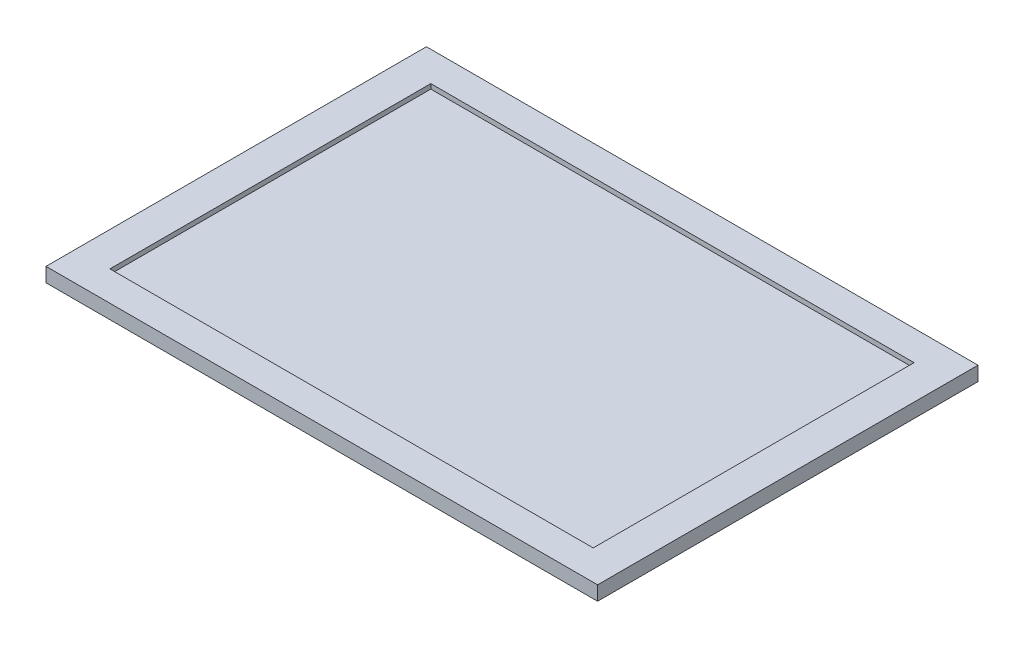
ISO-10303-21;
HEADER;
FILE_DESCRIPTION(('STEP AP214'),'2;1');
FILE_NAME('part.step','',(''),(''),'','','');
FILE_SCHEMA(('AUTOMOTIVE_DESIGN { 1 0 10303 214 1 1 1 1 }'));
ENDSEC;
DATA;
#1=APPLICATION_CONTEXT('core data for automotive mechanical design processes');
#2=APPLICATION_PROTOCOL_DEFINITION('international standard','automotive_design',2000,#1);
#3=PRODUCT_CONTEXT('',#1,'mechanical');
#4=PRODUCT('Part','Part','',(#3));
#5=PRODUCT_RELATED_PRODUCT_CATEGORY('part','',(#4));
#6=PRODUCT_DEFINITION_FORMATION('','',#4);
#7=PRODUCT_DEFINITION_CONTEXT('part definition',#1,'design');
#8=PRODUCT_DEFINITION('design','',#6,#7);
#9=PRODUCT_DEFINITION_SHAPE('','',#8);
#10=(LENGTH_UNIT() NAMED_UNIT(*) SI_UNIT(.MILLI.,.METRE.));
#11=(NAMED_UNIT(*) PLANE_ANGLE_UNIT() SI_UNIT($,.RADIAN.));
#12=(NAMED_UNIT(*) SI_UNIT($,.STERADIAN.) SOLID_ANGLE_UNIT());
#13=UNCERTAINTY_MEASURE_WITH_UNIT(LENGTH_MEASURE(1.E-05),#10,'distance_accuracy_value','');
#14=(GEOMETRIC_REPRESENTATION_CONTEXT(3) GLOBAL_UNCERTAINTY_ASSIGNED_CONTEXT((#13)) GLOBAL_UNIT_ASSIGNED_CONTEXT((#10,
#11,#12)) REPRESENTATION_CONTEXT('',''));
#15=CARTESIAN_POINT('',(0.,0.,0.));
#16=DIRECTION('',(0.,0.,1.));
#17=DIRECTION('',(1.,0.,0.));
#18=AXIS2_PLACEMENT_3D('',#15,#16,#17);
#19=CARTESIAN_POINT('',(147.32,7.62,101.6));
#20=DIRECTION('',(-1.,0.,0.));
#21=DIRECTION('',(0.,0.,1.));
#22=AXIS2_PLACEMENT_3D('',#19,#20,#21);
#23=PLANE('',#22);
#24=DIRECTION('',(0.,0.,-1.));
#25=VECTOR('',#24,1.);
#26=CARTESIAN_POINT('',(147.32,0.,101.6));
#27=LINE('',#26,#25);
#28=CARTESIAN_POINT('',(147.32,0.,101.6));
#29=VERTEX_POINT('',#28);
#30=CARTESIAN_POINT('',(147.32,0.,-101.6));
#31=VERTEX_POINT('',#30);
#32=EDGE_CURVE('E141',#29,#31,#27,.T.);
#33=ORIENTED_EDGE('',*,*,#32,.T.);
#34=DIRECTION('',(0.,-1.,0.));
#35=VECTOR('',#34,1.);
#36=CARTESIAN_POINT('',(147.32,7.62,-101.6));
#37=LINE('',#36,#35);
#38=CARTESIAN_POINT('',(147.32,7.62,-101.6));
#39=VERTEX_POINT('',#38);
#40=EDGE_CURVE('E11',#39,#31,#37,.T.);
#41=ORIENTED_EDGE('',*,*,#40,.F.);
#42=DIRECTION('',(0.,0.,-1.));
#43=VECTOR('',#42,1.);
#44=CARTESIAN_POINT('',(147.32,7.62,101.6));
#45=LINE('',#44,#43);
#46=CARTESIAN_POINT('',(147.32,7.62,101.6));
#47=VERTEX_POINT('',#46);
#48=EDGE_CURVE('E145',#47,#39,#45,.T.);
#49=ORIENTED_EDGE('',*,*,#48,.F.);
#50=DIRECTION('',(0.,-1.,0.));
#51=VECTOR('',#50,1.);
#52=CARTESIAN_POINT('',(147.32,7.62,101.6));
#53=LINE('',#52,#51);
#54=EDGE_CURVE('E151',#47,#29,#53,.T.);
#55=ORIENTED_EDGE('',*,*,#54,.T.);
#56=EDGE_LOOP('',(#33,#41,#49,#55));
#57=FACE_BOUND('',#56,.T.);
#58=ADVANCED_FACE('F33',(#57),#23,.F.);
#59=CARTESIAN_POINT('',(-147.32,7.62,-101.6));
#60=DIRECTION('',(0.,0.,1.));
#61=DIRECTION('',(1.,0.,0.));
#62=AXIS2_PLACEMENT_3D('',#59,#60,#61);
#63=PLANE('',#62);
#64=DIRECTION('',(-1.,0.,0.));
#65=VECTOR('',#64,1.);
#66=CARTESIAN_POINT('',(-147.32,0.,-101.6));
#67=LINE('',#66,#65);
#68=CARTESIAN_POINT('',(-147.32,0.,-101.6));
#69=VERTEX_POINT('',#68);
#70=EDGE_CURVE('E154',#31,#69,#67,.T.);
#71=ORIENTED_EDGE('',*,*,#70,.T.);
#72=DIRECTION('',(0.,-1.,0.));
#73=VECTOR('',#72,1.);
#74=CARTESIAN_POINT('',(-147.32,7.62,-101.6));
#75=LINE('',#74,#73);
#76=CARTESIAN_POINT('',(-147.32,7.62,-101.6));
#77=VERTEX_POINT('',#76);
#78=EDGE_CURVE('E40',#77,#69,#75,.T.);
#79=ORIENTED_EDGE('',*,*,#78,.F.);
#80=DIRECTION('',(-1.,0.,0.));
#81=VECTOR('',#80,1.);
#82=CARTESIAN_POINT('',(-147.32,7.62,-101.6));
#83=LINE('',#82,#81);
#84=EDGE_CURVE('E84',#39,#77,#83,.T.);
#85=ORIENTED_EDGE('',*,*,#84,.F.);
#86=ORIENTED_EDGE('',*,*,#40,.T.);
#87=EDGE_LOOP('',(#71,#79,#85,#86));
#88=FACE_BOUND('',#87,.T.);
#89=ADVANCED_FACE('F183',(#88),#63,.F.);
#90=CARTESIAN_POINT('',(-147.32,7.62,101.6));
#91=DIRECTION('',(1.,0.,0.));
#92=DIRECTION('',(0.,0.,-1.));
#93=AXIS2_PLACEMENT_3D('',#90,#91,#92);
#94=PLANE('',#93);
#95=DIRECTION('',(0.,0.,1.));
#96=VECTOR('',#95,1.);
#97=CARTESIAN_POINT('',(-147.32,0.,101.6));
#98=LINE('',#97,#96);
#99=CARTESIAN_POINT('',(-147.32,0.,101.6));
#100=VERTEX_POINT('',#99);
#101=EDGE_CURVE('E156',#69,#100,#98,.T.);
#102=ORIENTED_EDGE('',*,*,#101,.T.);
#103=DIRECTION('',(0.,-1.,0.));
#104=VECTOR('',#103,1.);
#105=CARTESIAN_POINT('',(-147.32,7.62,101.6));
#106=LINE('',#105,#104);
#107=CARTESIAN_POINT('',(-147.32,7.62,101.6));
#108=VERTEX_POINT('',#107);
#109=EDGE_CURVE('E160',#108,#100,#106,.T.);
#110=ORIENTED_EDGE('',*,*,#109,.F.);
#111=DIRECTION('',(0.,0.,1.));
#112=VECTOR('',#111,1.);
#113=CARTESIAN_POINT('',(-147.32,7.62,101.6));
#114=LINE('',#113,#112);
#115=EDGE_CURVE('E148',#77,#108,#114,.T.);
#116=ORIENTED_EDGE('',*,*,#115,.F.);
#117=ORIENTED_EDGE('',*,*,#78,.T.);
#118=EDGE_LOOP('',(#102,#110,#116,#117));
#119=FACE_BOUND('',#118,.T.);
#120=ADVANCED_FACE('F165',(#119),#94,.F.);
#121=CARTESIAN_POINT('',(-147.32,7.62,101.6));
#122=DIRECTION('',(0.,0.,-1.));
#123=DIRECTION('',(-1.,0.,0.));
#124=AXIS2_PLACEMENT_3D('',#121,#122,#123);
#125=PLANE('',#124);
#126=DIRECTION('',(1.,0.,0.));
#127=VECTOR('',#126,1.);
#128=CARTESIAN_POINT('',(-147.32,0.,101.6));
#129=LINE('',#128,#127);
#130=EDGE_CURVE('E77',#100,#29,#129,.T.);
#131=ORIENTED_EDGE('',*,*,#130,.T.);
#132=ORIENTED_EDGE('',*,*,#54,.F.);
#133=DIRECTION('',(1.,0.,0.));
#134=VECTOR('',#133,1.);
#135=CARTESIAN_POINT('',(-147.32,7.62,101.6));
#136=LINE('',#135,#134);
#137=EDGE_CURVE('E56',#108,#47,#136,.T.);
#138=ORIENTED_EDGE('',*,*,#137,.F.);
#139=ORIENTED_EDGE('',*,*,#109,.T.);
#140=EDGE_LOOP('',(#131,#132,#138,#139));
#141=FACE_BOUND('',#140,.T.);
#142=ADVANCED_FACE('F173',(#141),#125,.F.);
#143=CARTESIAN_POINT('',(0.,7.62,0.));
#144=DIRECTION('',(0.,-1.,0.));
#145=DIRECTION('',(0.,0.,-1.));
#146=AXIS2_PLACEMENT_3D('',#143,#144,#145);
#147=PLANE('',#146);
#148=DIRECTION('',(-1.,0.,0.));
#149=VECTOR('',#148,1.);
#150=CARTESIAN_POINT('',(-129.077610945295,7.62,-85.7051570948623));
#151=LINE('',#150,#149);
#152=CARTESIAN_POINT('',(129.077610945295,7.62,-85.7051570948623));
#153=VERTEX_POINT('',#152);
#154=CARTESIAN_POINT('',(-129.077610945295,7.62,-85.7051570948623));
#155=VERTEX_POINT('',#154);
#156=EDGE_CURVE('E135',#153,#155,#151,.T.);
#157=ORIENTED_EDGE('',*,*,#156,.F.);
#158=DIRECTION('',(0.,0.,-1.));
#159=VECTOR('',#158,1.);
#160=CARTESIAN_POINT('',(129.077610945295,7.62,85.7051570948623));
#161=LINE('',#160,#159);
#162=CARTESIAN_POINT('',(129.077610945295,7.62,85.7051570948623));
#163=VERTEX_POINT('',#162);
#164=EDGE_CURVE('E47',#163,#153,#161,.T.);
#165=ORIENTED_EDGE('',*,*,#164,.F.);
#166=DIRECTION('',(1.,0.,0.));
#167=VECTOR('',#166,1.);
#168=CARTESIAN_POINT('',(-129.077610945295,7.62,85.7051570948623));
#169=LINE('',#168,#167);
#170=CARTESIAN_POINT('',(-129.077610945295,7.62,85.7051570948623));
#171=VERTEX_POINT('',#170);
#172=EDGE_CURVE('E126',#171,#163,#169,.T.);
#173=ORIENTED_EDGE('',*,*,#172,.F.);
#174=DIRECTION('',(0.,0.,1.));
#175=VECTOR('',#174,1.);
#176=CARTESIAN_POINT('',(-129.077610945295,7.62,85.7051570948623));
#177=LINE('',#176,#175);
#178=EDGE_CURVE('E129',#155,#171,#177,.T.);
#179=ORIENTED_EDGE('',*,*,#178,.F.);
#180=EDGE_LOOP('',(#157,#165,#173,#179));
#181=FACE_BOUND('',#180,.T.);
#182=ORIENTED_EDGE('',*,*,#48,.T.);
#183=ORIENTED_EDGE('',*,*,#84,.T.);
#184=ORIENTED_EDGE('',*,*,#115,.T.);
#185=ORIENTED_EDGE('',*,*,#137,.T.);
#186=EDGE_LOOP('',(#182,#183,#184,#185));
#187=FACE_BOUND('',#186,.T.);
#188=ADVANCED_FACE('F175',(#181,#187),#147,.F.);
#189=CARTESIAN_POINT('',(0.,0.,0.));
#190=DIRECTION('',(0.,-1.,0.));
#191=DIRECTION('',(0.,0.,-1.));
#192=AXIS2_PLACEMENT_3D('',#189,#190,#191);
#193=PLANE('',#192);
#194=ORIENTED_EDGE('',*,*,#32,.F.);
#195=ORIENTED_EDGE('',*,*,#130,.F.);
#196=ORIENTED_EDGE('',*,*,#101,.F.);
#197=ORIENTED_EDGE('',*,*,#70,.F.);
#198=EDGE_LOOP('',(#194,#195,#196,#197));
#199=FACE_BOUND('',#198,.T.);
#200=ADVANCED_FACE('F169',(#199),#193,.T.);
#201=CARTESIAN_POINT('',(129.077610945295,5.08,85.7051570948623));
#202=DIRECTION('',(1.,0.,0.));
#203=DIRECTION('',(0.,0.,-1.));
#204=AXIS2_PLACEMENT_3D('',#201,#202,#203);
#205=PLANE('',#204);
#206=ORIENTED_EDGE('',*,*,#164,.T.);
#207=DIRECTION('',(0.,1.,0.));
#208=VECTOR('',#207,1.);
#209=CARTESIAN_POINT('',(129.077610945295,5.08,-85.7051570948623));
#210=LINE('',#209,#208);
#211=CARTESIAN_POINT('',(129.077610945295,5.08,-85.7051570948623));
#212=VERTEX_POINT('',#211);
#213=EDGE_CURVE('E104',#212,#153,#210,.T.);
#214=ORIENTED_EDGE('',*,*,#213,.F.);
#215=DIRECTION('',(0.,0.,-1.));
#216=VECTOR('',#215,1.);
#217=CARTESIAN_POINT('',(129.077610945295,5.08,85.7051570948623));
#218=LINE('',#217,#216);
#219=CARTESIAN_POINT('',(129.077610945295,5.08,85.7051570948623));
#220=VERTEX_POINT('',#219);
#221=EDGE_CURVE('E108',#220,#212,#218,.T.);
#222=ORIENTED_EDGE('',*,*,#221,.F.);
#223=DIRECTION('',(0.,1.,0.));
#224=VECTOR('',#223,1.);
#225=CARTESIAN_POINT('',(129.077610945295,5.08,85.7051570948623));
#226=LINE('',#225,#224);
#227=EDGE_CURVE('E139',#220,#163,#226,.T.);
#228=ORIENTED_EDGE('',*,*,#227,.T.);
#229=EDGE_LOOP('',(#206,#214,#222,#228));
#230=FACE_BOUND('',#229,.T.);
#231=ADVANCED_FACE('F106',(#230),#205,.F.);
#232=CARTESIAN_POINT('',(-129.077610945295,5.08,85.7051570948623));
#233=DIRECTION('',(0.,0.,1.));
#234=DIRECTION('',(1.,0.,0.));
#235=AXIS2_PLACEMENT_3D('',#232,#233,#234);
#236=PLANE('',#235);
#237=ORIENTED_EDGE('',*,*,#172,.T.);
#238=ORIENTED_EDGE('',*,*,#227,.F.);
#239=DIRECTION('',(1.,0.,0.));
#240=VECTOR('',#239,1.);
#241=CARTESIAN_POINT('',(-129.077610945295,5.08,85.7051570948623));
#242=LINE('',#241,#240);
#243=CARTESIAN_POINT('',(-129.077610945295,5.08,85.7051570948623));
#244=VERTEX_POINT('',#243);
#245=EDGE_CURVE('E114',#244,#220,#242,.T.);
#246=ORIENTED_EDGE('',*,*,#245,.F.);
#247=DIRECTION('',(0.,1.,0.));
#248=VECTOR('',#247,1.);
#249=CARTESIAN_POINT('',(-129.077610945295,5.08,85.7051570948623));
#250=LINE('',#249,#248);
#251=EDGE_CURVE('E142',#244,#171,#250,.T.);
#252=ORIENTED_EDGE('',*,*,#251,.T.);
#253=EDGE_LOOP('',(#237,#238,#246,#252));
#254=FACE_BOUND('',#253,.T.);
#255=ADVANCED_FACE('F222',(#254),#236,.F.);
#256=CARTESIAN_POINT('',(-129.077610945295,5.08,85.7051570948623));
#257=DIRECTION('',(-1.,0.,0.));
#258=DIRECTION('',(0.,0.,1.));
#259=AXIS2_PLACEMENT_3D('',#256,#257,#258);
#260=PLANE('',#259);
#261=ORIENTED_EDGE('',*,*,#178,.T.);
#262=ORIENTED_EDGE('',*,*,#251,.F.);
#263=DIRECTION('',(0.,0.,1.));
#264=VECTOR('',#263,1.);
#265=CARTESIAN_POINT('',(-129.077610945295,5.08,85.7051570948623));
#266=LINE('',#265,#264);
#267=CARTESIAN_POINT('',(-129.077610945295,5.08,-85.7051570948623));
#268=VERTEX_POINT('',#267);
#269=EDGE_CURVE('E122',#268,#244,#266,.T.);
#270=ORIENTED_EDGE('',*,*,#269,.F.);
#271=DIRECTION('',(0.,1.,0.));
#272=VECTOR('',#271,1.);
#273=CARTESIAN_POINT('',(-129.077610945295,5.08,-85.7051570948623));
#274=LINE('',#273,#272);
#275=EDGE_CURVE('E113',#268,#155,#274,.T.);
#276=ORIENTED_EDGE('',*,*,#275,.T.);
#277=EDGE_LOOP('',(#261,#262,#270,#276));
#278=FACE_BOUND('',#277,.T.);
#279=ADVANCED_FACE('F231',(#278),#260,.F.);
#280=CARTESIAN_POINT('',(-129.077610945295,5.08,-85.7051570948623));
#281=DIRECTION('',(0.,0.,-1.));
#282=DIRECTION('',(-1.,0.,0.));
#283=AXIS2_PLACEMENT_3D('',#280,#281,#282);
#284=PLANE('',#283);
#285=ORIENTED_EDGE('',*,*,#156,.T.);
#286=ORIENTED_EDGE('',*,*,#275,.F.);
#287=DIRECTION('',(-1.,0.,0.));
#288=VECTOR('',#287,1.);
#289=CARTESIAN_POINT('',(-129.077610945295,5.08,-85.7051570948623));
#290=LINE('',#289,#288);
#291=EDGE_CURVE('E117',#212,#268,#290,.T.);
#292=ORIENTED_EDGE('',*,*,#291,.F.);
#293=ORIENTED_EDGE('',*,*,#213,.T.);
#294=EDGE_LOOP('',(#285,#286,#292,#293));
#295=FACE_BOUND('',#294,.T.);
#296=ADVANCED_FACE('F118',(#295),#284,.F.);
#297=CARTESIAN_POINT('',(0.,5.08,0.));
#298=DIRECTION('',(0.,-1.,0.));
#299=DIRECTION('',(0.,0.,-1.));
#300=AXIS2_PLACEMENT_3D('',#297,#298,#299);
#301=PLANE('',#300);
#302=ORIENTED_EDGE('',*,*,#221,.T.);
#303=ORIENTED_EDGE('',*,*,#291,.T.);
#304=ORIENTED_EDGE('',*,*,#269,.T.);
#305=ORIENTED_EDGE('',*,*,#245,.T.);
#306=EDGE_LOOP('',(#302,#303,#304,#305));
#307=FACE_BOUND('',#306,.T.);
#308=ADVANCED_FACE('F124',(#307),#301,.F.);
#309=CLOSED_SHELL('',(#58,#89,#120,#142,#188,#200,#231,#255,#279,#296,#308));
#310=MANIFOLD_SOLID_BREP('B2',#309);
#311=ADVANCED_BREP_SHAPE_REPRESENTATION('',(#18,#310),#14);
#312=SHAPE_DEFINITION_REPRESENTATION(#9,#311);
ENDSEC;
END-ISO-10303-21;
